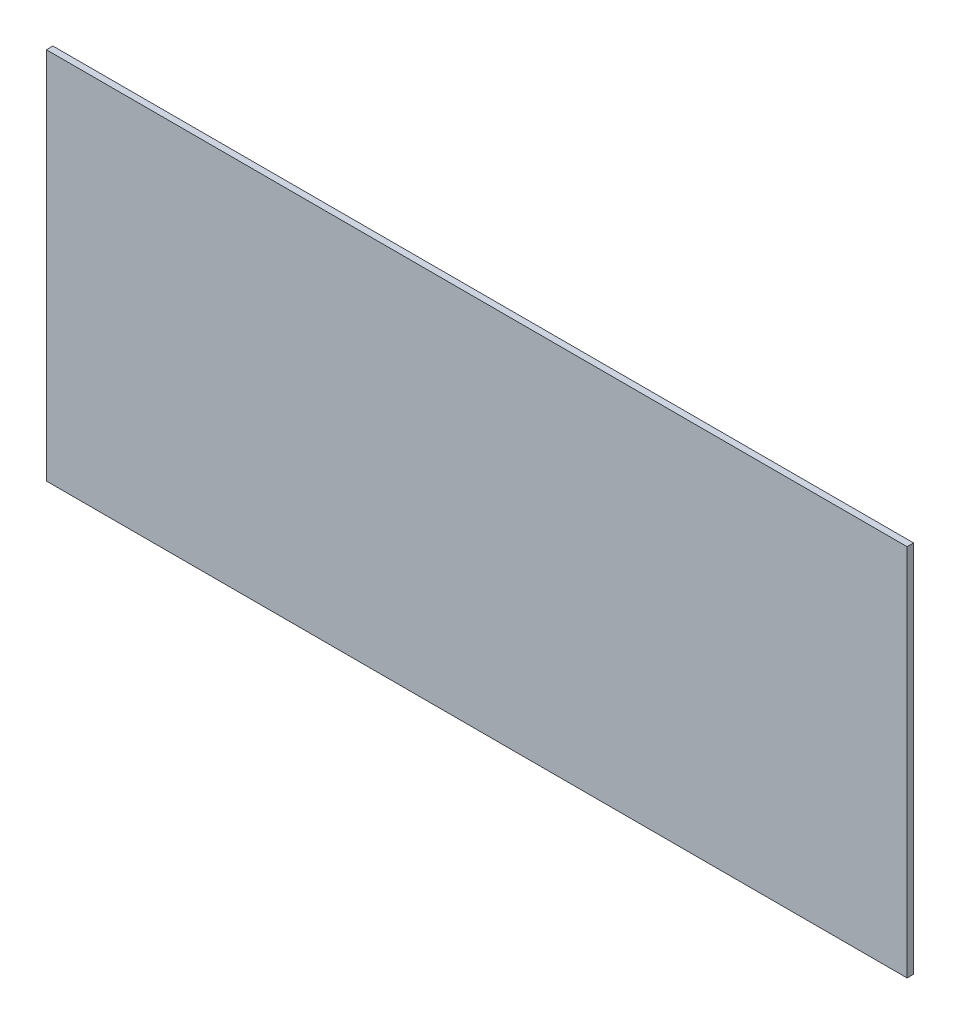
ISO-10303-21;
HEADER;
FILE_DESCRIPTION(('STEP AP214'),'2;1');
FILE_NAME('part.step','',(''),(''),'','','');
FILE_SCHEMA(('AUTOMOTIVE_DESIGN { 1 0 10303 214 1 1 1 1 }'));
ENDSEC;
DATA;
#1=APPLICATION_CONTEXT('core data for automotive mechanical design processes');
#2=APPLICATION_PROTOCOL_DEFINITION('international standard','automotive_design',2000,#1);
#3=PRODUCT_CONTEXT('',#1,'mechanical');
#4=PRODUCT('Part','Part','',(#3));
#5=PRODUCT_RELATED_PRODUCT_CATEGORY('part','',(#4));
#6=PRODUCT_DEFINITION_FORMATION('','',#4);
#7=PRODUCT_DEFINITION_CONTEXT('part definition',#1,'design');
#8=PRODUCT_DEFINITION('design','',#6,#7);
#9=PRODUCT_DEFINITION_SHAPE('','',#8);
#10=(LENGTH_UNIT() NAMED_UNIT(*) SI_UNIT(.MILLI.,.METRE.));
#11=(NAMED_UNIT(*) PLANE_ANGLE_UNIT() SI_UNIT($,.RADIAN.));
#12=(NAMED_UNIT(*) SI_UNIT($,.STERADIAN.) SOLID_ANGLE_UNIT());
#13=UNCERTAINTY_MEASURE_WITH_UNIT(LENGTH_MEASURE(1.E-05),#10,'distance_accuracy_value','');
#14=(GEOMETRIC_REPRESENTATION_CONTEXT(3) GLOBAL_UNCERTAINTY_ASSIGNED_CONTEXT((#13)) GLOBAL_UNIT_ASSIGNED_CONTEXT((#10,
#11,#12)) REPRESENTATION_CONTEXT('',''));
#15=CARTESIAN_POINT('',(0.,0.,0.));
#16=DIRECTION('',(0.,0.,1.));
#17=DIRECTION('',(1.,0.,0.));
#18=AXIS2_PLACEMENT_3D('',#15,#16,#17);
#19=CARTESIAN_POINT('',(-265.,-115.,4.));
#20=DIRECTION('',(1.,0.,0.));
#21=DIRECTION('',(0.,0.,-1.));
#22=AXIS2_PLACEMENT_3D('',#19,#20,#21);
#23=PLANE('',#22);
#24=DIRECTION('',(0.,-1.,0.));
#25=VECTOR('',#24,1.);
#26=CARTESIAN_POINT('',(-265.,-115.,0.));
#27=LINE('',#26,#25);
#28=CARTESIAN_POINT('',(-265.,115.,0.));
#29=VERTEX_POINT('',#28);
#30=CARTESIAN_POINT('',(-265.,-115.,0.));
#31=VERTEX_POINT('',#30);
#32=EDGE_CURVE('E96',#29,#31,#27,.T.);
#33=ORIENTED_EDGE('',*,*,#32,.T.);
#34=DIRECTION('',(0.,0.,-1.));
#35=VECTOR('',#34,1.);
#36=CARTESIAN_POINT('',(-265.,-115.,4.));
#37=LINE('',#36,#35);
#38=CARTESIAN_POINT('',(-265.,-115.,4.));
#39=VERTEX_POINT('',#38);
#40=EDGE_CURVE('E11',#39,#31,#37,.T.);
#41=ORIENTED_EDGE('',*,*,#40,.F.);
#42=DIRECTION('',(0.,-1.,0.));
#43=VECTOR('',#42,1.);
#44=CARTESIAN_POINT('',(-265.,-115.,4.));
#45=LINE('',#44,#43);
#46=CARTESIAN_POINT('',(-265.,115.,4.));
#47=VERTEX_POINT('',#46);
#48=EDGE_CURVE('E84',#47,#39,#45,.T.);
#49=ORIENTED_EDGE('',*,*,#48,.F.);
#50=DIRECTION('',(0.,0.,-1.));
#51=VECTOR('',#50,1.);
#52=CARTESIAN_POINT('',(-265.,115.,4.));
#53=LINE('',#52,#51);
#54=EDGE_CURVE('E92',#47,#29,#53,.T.);
#55=ORIENTED_EDGE('',*,*,#54,.T.);
#56=EDGE_LOOP('',(#33,#41,#49,#55));
#57=FACE_BOUND('',#56,.T.);
#58=ADVANCED_FACE('F33',(#57),#23,.F.);
#59=CARTESIAN_POINT('',(265.,-115.,4.));
#60=DIRECTION('',(0.,1.,0.));
#61=DIRECTION('',(-1.,0.,0.));
#62=AXIS2_PLACEMENT_3D('',#59,#60,#61);
#63=PLANE('',#62);
#64=DIRECTION('',(1.,0.,0.));
#65=VECTOR('',#64,1.);
#66=CARTESIAN_POINT('',(265.,-115.,0.));
#67=LINE('',#66,#65);
#68=CARTESIAN_POINT('',(265.,-115.,0.));
#69=VERTEX_POINT('',#68);
#70=EDGE_CURVE('E88',#31,#69,#67,.T.);
#71=ORIENTED_EDGE('',*,*,#70,.T.);
#72=DIRECTION('',(0.,0.,-1.));
#73=VECTOR('',#72,1.);
#74=CARTESIAN_POINT('',(265.,-115.,4.));
#75=LINE('',#74,#73);
#76=CARTESIAN_POINT('',(265.,-115.,4.));
#77=VERTEX_POINT('',#76);
#78=EDGE_CURVE('E41',#77,#69,#75,.T.);
#79=ORIENTED_EDGE('',*,*,#78,.F.);
#80=DIRECTION('',(1.,0.,0.));
#81=VECTOR('',#80,1.);
#82=CARTESIAN_POINT('',(265.,-115.,4.));
#83=LINE('',#82,#81);
#84=EDGE_CURVE('E79',#39,#77,#83,.T.);
#85=ORIENTED_EDGE('',*,*,#84,.F.);
#86=ORIENTED_EDGE('',*,*,#40,.T.);
#87=EDGE_LOOP('',(#71,#79,#85,#86));
#88=FACE_BOUND('',#87,.T.);
#89=ADVANCED_FACE('F87',(#88),#63,.F.);
#90=CARTESIAN_POINT('',(265.,-115.,4.));
#91=DIRECTION('',(-1.,0.,0.));
#92=DIRECTION('',(0.,0.,1.));
#93=AXIS2_PLACEMENT_3D('',#90,#91,#92);
#94=PLANE('',#93);
#95=DIRECTION('',(0.,1.,0.));
#96=VECTOR('',#95,1.);
#97=CARTESIAN_POINT('',(265.,-115.,0.));
#98=LINE('',#97,#96);
#99=CARTESIAN_POINT('',(265.,115.,0.));
#100=VERTEX_POINT('',#99);
#101=EDGE_CURVE('E66',#69,#100,#98,.T.);
#102=ORIENTED_EDGE('',*,*,#101,.T.);
#103=DIRECTION('',(0.,0.,-1.));
#104=VECTOR('',#103,1.);
#105=CARTESIAN_POINT('',(265.,115.,4.));
#106=LINE('',#105,#104);
#107=CARTESIAN_POINT('',(265.,115.,4.));
#108=VERTEX_POINT('',#107);
#109=EDGE_CURVE('E89',#108,#100,#106,.T.);
#110=ORIENTED_EDGE('',*,*,#109,.F.);
#111=DIRECTION('',(0.,1.,0.));
#112=VECTOR('',#111,1.);
#113=CARTESIAN_POINT('',(265.,-115.,4.));
#114=LINE('',#113,#112);
#115=EDGE_CURVE('E82',#77,#108,#114,.T.);
#116=ORIENTED_EDGE('',*,*,#115,.F.);
#117=ORIENTED_EDGE('',*,*,#78,.T.);
#118=EDGE_LOOP('',(#102,#110,#116,#117));
#119=FACE_BOUND('',#118,.T.);
#120=ADVANCED_FACE('F90',(#119),#94,.F.);
#121=CARTESIAN_POINT('',(265.,115.,4.));
#122=DIRECTION('',(0.,-1.,0.));
#123=DIRECTION('',(1.,0.,0.));
#124=AXIS2_PLACEMENT_3D('',#121,#122,#123);
#125=PLANE('',#124);
#126=DIRECTION('',(-1.,0.,0.));
#127=VECTOR('',#126,1.);
#128=CARTESIAN_POINT('',(265.,115.,0.));
#129=LINE('',#128,#127);
#130=EDGE_CURVE('E72',#100,#29,#129,.T.);
#131=ORIENTED_EDGE('',*,*,#130,.T.);
#132=ORIENTED_EDGE('',*,*,#54,.F.);
#133=DIRECTION('',(-1.,0.,0.));
#134=VECTOR('',#133,1.);
#135=CARTESIAN_POINT('',(265.,115.,4.));
#136=LINE('',#135,#134);
#137=EDGE_CURVE('E49',#108,#47,#136,.T.);
#138=ORIENTED_EDGE('',*,*,#137,.F.);
#139=ORIENTED_EDGE('',*,*,#109,.T.);
#140=EDGE_LOOP('',(#131,#132,#138,#139));
#141=FACE_BOUND('',#140,.T.);
#142=ADVANCED_FACE('F103',(#141),#125,.F.);
#143=CARTESIAN_POINT('',(0.,0.,4.));
#144=DIRECTION('',(0.,0.,1.));
#145=DIRECTION('',(1.,0.,0.));
#146=AXIS2_PLACEMENT_3D('',#143,#144,#145);
#147=PLANE('',#146);
#148=ORIENTED_EDGE('',*,*,#48,.T.);
#149=ORIENTED_EDGE('',*,*,#84,.T.);
#150=ORIENTED_EDGE('',*,*,#115,.T.);
#151=ORIENTED_EDGE('',*,*,#137,.T.);
#152=EDGE_LOOP('',(#148,#149,#150,#151));
#153=FACE_BOUND('',#152,.T.);
#154=ADVANCED_FACE('F80',(#153),#147,.T.);
#155=CARTESIAN_POINT('',(0.,0.,0.));
#156=DIRECTION('',(0.,0.,1.));
#157=DIRECTION('',(1.,0.,0.));
#158=AXIS2_PLACEMENT_3D('',#155,#156,#157);
#159=PLANE('',#158);
#160=ORIENTED_EDGE('',*,*,#32,.F.);
#161=ORIENTED_EDGE('',*,*,#130,.F.);
#162=ORIENTED_EDGE('',*,*,#101,.F.);
#163=ORIENTED_EDGE('',*,*,#70,.F.);
#164=EDGE_LOOP('',(#160,#161,#162,#163));
#165=FACE_BOUND('',#164,.T.);
#166=ADVANCED_FACE('F106',(#165),#159,.F.);
#167=CLOSED_SHELL('',(#58,#89,#120,#142,#154,#166));
#168=MANIFOLD_SOLID_BREP('B2',#167);
#169=ADVANCED_BREP_SHAPE_REPRESENTATION('',(#18,#168),#14);
#170=SHAPE_DEFINITION_REPRESENTATION(#9,#169);
ENDSEC;
END-ISO-10303-21;
